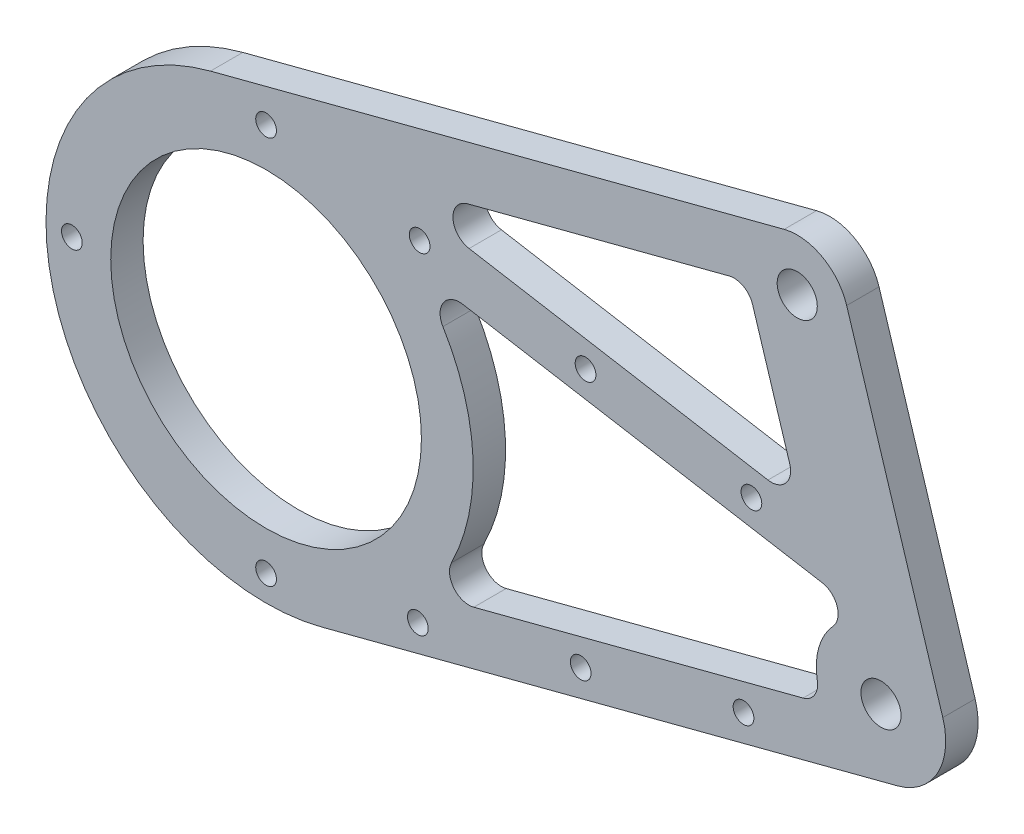
ISO-10303-21;
HEADER;
FILE_DESCRIPTION(('STEP AP214'),'2;1');
FILE_NAME('part.step','',(''),(''),'','','');
FILE_SCHEMA(('AUTOMOTIVE_DESIGN { 1 0 10303 214 1 1 1 1 }'));
ENDSEC;
DATA;
#1=APPLICATION_CONTEXT('core data for automotive mechanical design processes');
#2=APPLICATION_PROTOCOL_DEFINITION('international standard','automotive_design',2000,#1);
#3=PRODUCT_CONTEXT('',#1,'mechanical');
#4=PRODUCT('Part','Part','',(#3));
#5=PRODUCT_RELATED_PRODUCT_CATEGORY('part','',(#4));
#6=PRODUCT_DEFINITION_FORMATION('','',#4);
#7=PRODUCT_DEFINITION_CONTEXT('part definition',#1,'design');
#8=PRODUCT_DEFINITION('design','',#6,#7);
#9=PRODUCT_DEFINITION_SHAPE('','',#8);
#10=(LENGTH_UNIT() NAMED_UNIT(*) SI_UNIT(.MILLI.,.METRE.));
#11=(NAMED_UNIT(*) PLANE_ANGLE_UNIT() SI_UNIT($,.RADIAN.));
#12=(NAMED_UNIT(*) SI_UNIT($,.STERADIAN.) SOLID_ANGLE_UNIT());
#13=UNCERTAINTY_MEASURE_WITH_UNIT(LENGTH_MEASURE(1.E-05),#10,'distance_accuracy_value','');
#14=(GEOMETRIC_REPRESENTATION_CONTEXT(3) GLOBAL_UNCERTAINTY_ASSIGNED_CONTEXT((#13)) GLOBAL_UNIT_ASSIGNED_CONTEXT((#10,
#11,#12)) REPRESENTATION_CONTEXT('',''));
#15=CARTESIAN_POINT('',(0.,0.,0.));
#16=DIRECTION('',(0.,0.,1.));
#17=DIRECTION('',(1.,0.,0.));
#18=AXIS2_PLACEMENT_3D('',#15,#16,#17);
#19=CARTESIAN_POINT('',(-95.,0.,5.));
#20=DIRECTION('',(0.,0.,1.));
#21=DIRECTION('',(1.,0.,0.));
#22=AXIS2_PLACEMENT_3D('',#19,#20,#21);
#23=PLANE('',#22);
#24=DIRECTION('',(-0.297248940029587,0.954800014480146,0.));
#25=VECTOR('',#24,1.);
#26=CARTESIAN_POINT('',(-14.1227086600086,25.178769123046,5.));
#27=LINE('',#26,#25);
#28=CARTESIAN_POINT('',(-14.0963231227554,25.0940155446181,5.));
#29=VERTEX_POINT('',#28);
#30=CARTESIAN_POINT('',(-19.8385412249266,43.5387236285409,5.));
#31=VERTEX_POINT('',#30);
#32=EDGE_CURVE('E265',#29,#31,#27,.T.);
#33=ORIENTED_EDGE('',*,*,#32,.F.);
#34=CARTESIAN_POINT('',(-16.9607231661959,24.2022687245293,5.));
#35=DIRECTION('',(0.,0.,1.));
#36=DIRECTION('',(1.,0.,0.));
#37=AXIS2_PLACEMENT_3D('',#34,#35,#36);
#38=CIRCLE('',#37,3.);
#39=CARTESIAN_POINT('',(-17.4659863240906,21.2451232865648,5.));
#40=VERTEX_POINT('',#39);
#41=EDGE_CURVE('E11',#29,#40,#38,.F.);
#42=ORIENTED_EDGE('',*,*,#41,.T.);
#43=DIRECTION('',(0.985715145988166,-0.168421052631579,0.));
#44=VECTOR('',#43,1.);
#45=CARTESIAN_POINT('',(-89.2736842105262,33.5143149635983,5.));
#46=LINE('',#45,#44);
#47=CARTESIAN_POINT('',(-63.6377610345813,29.1341152841599,5.));
#48=VERTEX_POINT('',#47);
#49=EDGE_CURVE('E549',#48,#40,#46,.T.);
#50=ORIENTED_EDGE('',*,*,#49,.F.);
#51=CARTESIAN_POINT('',(-63.1324978766865,32.0912607221244,5.));
#52=DIRECTION('',(0.,0.,1.));
#53=DIRECTION('',(1.,0.,0.));
#54=AXIS2_PLACEMENT_3D('',#51,#52,#53);
#55=CIRCLE('',#54,3.);
#56=CARTESIAN_POINT('',(-63.8903601607645,34.9939568409719,5.));
#57=VERTEX_POINT('',#56);
#58=EDGE_CURVE('E255',#48,#57,#55,.F.);
#59=ORIENTED_EDGE('',*,*,#58,.T.);
#60=DIRECTION('',(-0.967565372949157,-0.252620761359313,0.));
#61=VECTOR('',#60,1.);
#62=CARTESIAN_POINT('',(-101.568139795342,25.1566996966781,5.));
#63=LINE('',#62,#61);
#64=CARTESIAN_POINT('',(-23.460803552445,45.5496729272996,5.));
#65=VERTEX_POINT('',#64);
#66=EDGE_CURVE('E268',#65,#57,#63,.T.);
#67=ORIENTED_EDGE('',*,*,#66,.F.);
#68=CARTESIAN_POINT('',(-22.7029412683671,42.6469768084522,5.));
#69=DIRECTION('',(0.,0.,1.));
#70=DIRECTION('',(1.,0.,0.));
#71=AXIS2_PLACEMENT_3D('',#68,#69,#70);
#72=CIRCLE('',#71,3.);
#73=EDGE_CURVE('E258',#65,#31,#72,.F.);
#74=ORIENTED_EDGE('',*,*,#73,.T.);
#75=EDGE_LOOP('',(#33,#42,#50,#59,#67,#74));
#76=FACE_BOUND('',#75,.T.);
#77=CARTESIAN_POINT('',(0.,0.,5.));
#78=DIRECTION('',(0.,0.,1.));
#79=DIRECTION('',(1.,0.,0.));
#80=AXIS2_PLACEMENT_3D('',#77,#78,#79);
#81=CIRCLE('',#80,10.0000000000004);
#82=CARTESIAN_POINT('',(-9.8412888861384,-1.77455150941748,5.));
#83=VERTEX_POINT('',#82);
#84=CARTESIAN_POINT('',(-7.39924695863323,6.72689708893811,5.));
#85=VERTEX_POINT('',#84);
#86=EDGE_CURVE('E347',#83,#85,#81,.F.);
#87=ORIENTED_EDGE('',*,*,#86,.F.);
#88=CARTESIAN_POINT('',(-12.7936755519798,-2.3069169622427,5.));
#89=DIRECTION('',(0.,0.,1.));
#90=DIRECTION('',(1.,0.,0.));
#91=AXIS2_PLACEMENT_3D('',#88,#89,#90);
#92=CIRCLE('',#91,3.);
#93=CARTESIAN_POINT('',(-12.0357808151377,-5.20960460783377,5.));
#94=VERTEX_POINT('',#93);
#95=EDGE_CURVE('E237',#83,#94,#92,.F.);
#96=ORIENTED_EDGE('',*,*,#95,.T.);
#97=DIRECTION('',(0.967562548530357,0.252631578947369,0.));
#98=VECTOR('',#97,1.);
#99=CARTESIAN_POINT('',(-88.4315789473688,-25.1566262617878,5.));
#100=LINE('',#99,#98);
#101=CARTESIAN_POINT('',(-62.9055257745459,-18.491747461818,5.));
#102=VERTEX_POINT('',#101);
#103=EDGE_CURVE('E344',#102,#94,#100,.T.);
#104=ORIENTED_EDGE('',*,*,#103,.F.);
#105=CARTESIAN_POINT('',(-63.663420511388,-15.5890598162269,5.));
#106=DIRECTION('',(0.,0.,1.));
#107=DIRECTION('',(1.,0.,0.));
#108=AXIS2_PLACEMENT_3D('',#105,#106,#107);
#109=CIRCLE('',#108,3.);
#110=CARTESIAN_POINT('',(-66.3494130389833,-14.2528546891217,5.));
#111=VERTEX_POINT('',#110);
#112=EDGE_CURVE('E233',#102,#111,#109,.F.);
#113=ORIENTED_EDGE('',*,*,#112,.T.);
#114=CARTESIAN_POINT('',(-95.,0.,5.));
#115=DIRECTION('',(0.,0.,1.));
#116=DIRECTION('',(1.,0.,0.));
#117=AXIS2_PLACEMENT_3D('',#114,#115,#116);
#118=CIRCLE('',#117,32.);
#119=CARTESIAN_POINT('',(-67.6823901300333,16.6657790394657,5.));
#120=VERTEX_POINT('',#119);
#121=EDGE_CURVE('E352',#120,#111,#118,.F.);
#122=ORIENTED_EDGE('',*,*,#121,.F.);
#123=CARTESIAN_POINT('',(-65.1213642047239,18.2281958244156,5.));
#124=DIRECTION('',(0.,0.,1.));
#125=DIRECTION('',(1.,0.,0.));
#126=AXIS2_PLACEMENT_3D('',#123,#124,#125);
#127=CIRCLE('',#126,3.);
#128=CARTESIAN_POINT('',(-64.6161010468291,21.1853412623801,5.));
#129=VERTEX_POINT('',#128);
#130=EDGE_CURVE('E229',#120,#129,#127,.F.);
#131=ORIENTED_EDGE('',*,*,#130,.T.);
#132=DIRECTION('',(-0.985715145988166,0.168421052631579,0.));
#133=VECTOR('',#132,1.);
#134=CARTESIAN_POINT('',(-90.6210526315788,25.628593795693,5.));
#135=LINE('',#134,#133);
#136=CARTESIAN_POINT('',(-9.11375788832837,11.702111653584,5.));
#137=VERTEX_POINT('',#136);
#138=EDGE_CURVE('E356',#137,#129,#135,.T.);
#139=ORIENTED_EDGE('',*,*,#138,.F.);
#140=CARTESIAN_POINT('',(-9.61902104622312,8.74496621561947,5.));
#141=DIRECTION('',(0.,0.,1.));
#142=DIRECTION('',(1.,0.,0.));
#143=AXIS2_PLACEMENT_3D('',#140,#141,#142);
#144=CIRCLE('',#143,3.);
#145=EDGE_CURVE('E225',#137,#85,#144,.F.);
#146=ORIENTED_EDGE('',*,*,#145,.T.);
#147=EDGE_LOOP('',(#87,#96,#104,#113,#122,#131,#139,#146));
#148=FACE_BOUND('',#147,.T.);
#149=CARTESIAN_POINT('',(-20.0172445160038,17.6230683508006,5.));
#150=DIRECTION('',(0.,0.,1.));
#151=DIRECTION('',(1.,0.,0.));
#152=AXIS2_PLACEMENT_3D('',#149,#150,#151);
#153=CIRCLE('',#152,1.6);
#154=CARTESIAN_POINT('',(-18.4172445160038,17.6230683508006,5.));
#155=VERTEX_POINT('',#154);
#156=EDGE_CURVE('E417',#155,#155,#153,.T.);
#157=ORIENTED_EDGE('',*,*,#156,.F.);
#158=EDGE_LOOP('',(#157));
#159=FACE_BOUND('',#158,.T.);
#160=CARTESIAN_POINT('',(-45.6458383116961,22.0020157192217,5.));
#161=DIRECTION('',(0.,0.,1.));
#162=DIRECTION('',(1.,0.,0.));
#163=AXIS2_PLACEMENT_3D('',#160,#161,#162);
#164=CIRCLE('',#163,1.6);
#165=CARTESIAN_POINT('',(-44.0458383116961,22.0020157192217,5.));
#166=VERTEX_POINT('',#165);
#167=EDGE_CURVE('E414',#166,#166,#164,.T.);
#168=ORIENTED_EDGE('',*,*,#167,.F.);
#169=EDGE_LOOP('',(#168));
#170=FACE_BOUND('',#169,.T.);
#171=CARTESIAN_POINT('',(-71.2744321073884,26.3809630876427,5.));
#172=DIRECTION('',(0.,0.,1.));
#173=DIRECTION('',(1.,0.,0.));
#174=AXIS2_PLACEMENT_3D('',#171,#172,#173);
#175=CIRCLE('',#174,1.6);
#176=CARTESIAN_POINT('',(-69.6744321073884,26.3809630876427,5.));
#177=VERTEX_POINT('',#176);
#178=EDGE_CURVE('E411',#177,#177,#175,.T.);
#179=ORIENTED_EDGE('',*,*,#178,.F.);
#180=EDGE_LOOP('',(#179));
#181=FACE_BOUND('',#180,.T.);
#182=CARTESIAN_POINT('',(-95.,30.0000000000015,5.));
#183=DIRECTION('',(0.,0.,1.));
#184=DIRECTION('',(1.,0.,0.));
#185=AXIS2_PLACEMENT_3D('',#182,#183,#184);
#186=CIRCLE('',#185,1.60000000000103);
#187=CARTESIAN_POINT('',(-93.399999999999,30.0000000000015,5.));
#188=VERTEX_POINT('',#187);
#189=EDGE_CURVE('E408',#188,#188,#186,.T.);
#190=ORIENTED_EDGE('',*,*,#189,.F.);
#191=EDGE_LOOP('',(#190));
#192=FACE_BOUND('',#191,.T.);
#193=CARTESIAN_POINT('',(-125.000000000002,0.,5.));
#194=DIRECTION('',(0.,0.,1.));
#195=DIRECTION('',(1.,0.,0.));
#196=AXIS2_PLACEMENT_3D('',#193,#194,#195);
#197=CIRCLE('',#196,1.59999999999999);
#198=CARTESIAN_POINT('',(-123.400000000002,0.,5.));
#199=VERTEX_POINT('',#198);
#200=EDGE_CURVE('E405',#199,#199,#197,.T.);
#201=ORIENTED_EDGE('',*,*,#200,.F.);
#202=EDGE_LOOP('',(#201));
#203=FACE_BOUND('',#202,.T.);
#204=CARTESIAN_POINT('',(-95.,-30.0000000000015,5.));
#205=DIRECTION('',(0.,0.,1.));
#206=DIRECTION('',(1.,0.,0.));
#207=AXIS2_PLACEMENT_3D('',#204,#205,#206);
#208=CIRCLE('',#207,1.60000000000046);
#209=CARTESIAN_POINT('',(-93.3999999999995,-30.0000000000015,5.));
#210=VERTEX_POINT('',#209);
#211=EDGE_CURVE('E402',#210,#210,#208,.T.);
#212=ORIENTED_EDGE('',*,*,#211,.F.);
#213=EDGE_LOOP('',(#212));
#214=FACE_BOUND('',#213,.T.);
#215=CARTESIAN_POINT('',(-71.5517535365,-24.8833861014445,5.));
#216=DIRECTION('',(0.,0.,1.));
#217=DIRECTION('',(1.,0.,0.));
#218=AXIS2_PLACEMENT_3D('',#215,#216,#217);
#219=CIRCLE('',#218,1.6);
#220=CARTESIAN_POINT('',(-69.9517535365,-24.8833861014445,5.));
#221=VERTEX_POINT('',#220);
#222=EDGE_CURVE('E399',#221,#221,#219,.T.);
#223=ORIENTED_EDGE('',*,*,#222,.F.);
#224=EDGE_LOOP('',(#223));
#225=FACE_BOUND('',#224,.T.);
#226=CARTESIAN_POINT('',(-46.3951272747108,-18.314965048813,5.));
#227=DIRECTION('',(0.,0.,1.));
#228=DIRECTION('',(1.,0.,0.));
#229=AXIS2_PLACEMENT_3D('',#226,#227,#228);
#230=CIRCLE('',#229,1.6);
#231=CARTESIAN_POINT('',(-44.7951272747108,-18.314965048813,5.));
#232=VERTEX_POINT('',#231);
#233=EDGE_CURVE('E396',#232,#232,#230,.T.);
#234=ORIENTED_EDGE('',*,*,#233,.F.);
#235=EDGE_LOOP('',(#234));
#236=FACE_BOUND('',#235,.T.);
#237=CARTESIAN_POINT('',(-21.2385010129215,-11.7465439961814,5.));
#238=DIRECTION('',(0.,0.,1.));
#239=DIRECTION('',(1.,0.,0.));
#240=AXIS2_PLACEMENT_3D('',#237,#238,#239);
#241=CIRCLE('',#240,1.6);
#242=CARTESIAN_POINT('',(-19.6385010129215,-11.7465439961814,5.));
#243=VERTEX_POINT('',#242);
#244=EDGE_CURVE('E393',#243,#243,#241,.T.);
#245=ORIENTED_EDGE('',*,*,#244,.F.);
#246=EDGE_LOOP('',(#245));
#247=FACE_BOUND('',#246,.T.);
#248=CARTESIAN_POINT('',(-95.,0.,5.));
#249=DIRECTION('',(0.,0.,1.));
#250=DIRECTION('',(1.,0.,0.));
#251=AXIS2_PLACEMENT_3D('',#248,#249,#250);
#252=CIRCLE('',#251,24.);
#253=CARTESIAN_POINT('',(-71.,0.,5.));
#254=VERTEX_POINT('',#253);
#255=EDGE_CURVE('E427',#254,#254,#252,.T.);
#256=ORIENTED_EDGE('',*,*,#255,.F.);
#257=EDGE_LOOP('',(#256));
#258=FACE_BOUND('',#257,.T.);
#259=CARTESIAN_POINT('',(-95.,0.,5.));
#260=DIRECTION('',(0.,0.,1.));
#261=DIRECTION('',(1.,0.,0.));
#262=AXIS2_PLACEMENT_3D('',#259,#260,#261);
#263=CIRCLE('',#262,34.);
#264=CARTESIAN_POINT('',(-103.589105886217,32.8972226802713,5.));
#265=VERTEX_POINT('',#264);
#266=CARTESIAN_POINT('',(-86.4105263157895,-32.8971266500322,5.));
#267=VERTEX_POINT('',#266);
#268=EDGE_CURVE('E184',#265,#267,#263,.T.);
#269=ORIENTED_EDGE('',*,*,#268,.T.);
#270=DIRECTION('',(0.967562548530357,0.252631578947369,0.));
#271=VECTOR('',#270,1.);
#272=CARTESIAN_POINT('',(-86.4105263157895,-32.8971266500322,5.));
#273=LINE('',#272,#271);
#274=CARTESIAN_POINT('',(2.52631578947369,-9.67562548530357,5.));
#275=VERTEX_POINT('',#274);
#276=EDGE_CURVE('E173',#267,#275,#273,.T.);
#277=ORIENTED_EDGE('',*,*,#276,.T.);
#278=CARTESIAN_POINT('',(0.,0.,5.));
#279=DIRECTION('',(0.,0.,1.));
#280=DIRECTION('',(1.,0.,0.));
#281=AXIS2_PLACEMENT_3D('',#278,#279,#280);
#282=CIRCLE('',#281,10.);
#283=CARTESIAN_POINT('',(9.54800014480146,2.97248940029587,5.));
#284=VERTEX_POINT('',#283);
#285=EDGE_CURVE('E183',#275,#284,#282,.T.);
#286=ORIENTED_EDGE('',*,*,#285,.T.);
#287=DIRECTION('',(-0.297248940029587,0.954800014480146,0.));
#288=VECTOR('',#287,1.);
#289=CARTESIAN_POINT('',(-5.30255213928509,50.6742828346901,5.));
#290=LINE('',#289,#288);
#291=CARTESIAN_POINT('',(-5.30255213928508,50.6742828346901,5.));
#292=VERTEX_POINT('',#291);
#293=EDGE_CURVE('E439',#284,#292,#290,.T.);
#294=ORIENTED_EDGE('',*,*,#293,.T.);
#295=CARTESIAN_POINT('',(-12.9409522551263,48.2962913144534,5.));
#296=DIRECTION('',(0.,0.,1.));
#297=DIRECTION('',(1.,0.,0.));
#298=AXIS2_PLACEMENT_3D('',#295,#296,#297);
#299=CIRCLE('',#298,8.00000000000001);
#300=CARTESIAN_POINT('',(-14.9619183460008,56.0368142980466,5.));
#301=VERTEX_POINT('',#300);
#302=EDGE_CURVE('E441',#292,#301,#299,.T.);
#303=ORIENTED_EDGE('',*,*,#302,.T.);
#304=DIRECTION('',(-0.967565372949157,-0.252620761359313,0.));
#305=VECTOR('',#304,1.);
#306=CARTESIAN_POINT('',(-103.589105886217,32.8972226802713,5.));
#307=LINE('',#306,#305);
#308=EDGE_CURVE('E189',#301,#265,#307,.T.);
#309=ORIENTED_EDGE('',*,*,#308,.T.);
#310=EDGE_LOOP('',(#269,#277,#286,#294,#303,#309));
#311=FACE_BOUND('',#310,.T.);
#312=CARTESIAN_POINT('',(0.,0.,5.));
#313=DIRECTION('',(0.,0.,1.));
#314=DIRECTION('',(1.,0.,0.));
#315=AXIS2_PLACEMENT_3D('',#312,#313,#314);
#316=CIRCLE('',#315,3.1);
#317=CARTESIAN_POINT('',(3.1,0.,5.));
#318=VERTEX_POINT('',#317);
#319=EDGE_CURVE('E433',#318,#318,#316,.T.);
#320=ORIENTED_EDGE('',*,*,#319,.F.);
#321=EDGE_LOOP('',(#320));
#322=FACE_BOUND('',#321,.T.);
#323=CARTESIAN_POINT('',(-12.9409522551263,48.2962913144534,5.));
#324=DIRECTION('',(0.,0.,1.));
#325=DIRECTION('',(1.,0.,0.));
#326=AXIS2_PLACEMENT_3D('',#323,#324,#325);
#327=CIRCLE('',#326,3.1);
#328=CARTESIAN_POINT('',(-9.84095225512626,48.2962913144534,5.));
#329=VERTEX_POINT('',#328);
#330=EDGE_CURVE('E421',#329,#329,#327,.T.);
#331=ORIENTED_EDGE('',*,*,#330,.F.);
#332=EDGE_LOOP('',(#331));
#333=FACE_BOUND('',#332,.T.);
#334=ADVANCED_FACE('F36',(#76,#148,#159,#170,#181,#192,#203,#214,#225,#236,#247,#258,#311,#322,
#333),#23,.T.);
#335=CARTESIAN_POINT('',(-95.,0.,0.));
#336=DIRECTION('',(0.,0.,1.));
#337=DIRECTION('',(1.,0.,0.));
#338=AXIS2_PLACEMENT_3D('',#335,#336,#337);
#339=PLANE('',#338);
#340=DIRECTION('',(-0.985715145988166,0.168421052631579,0.));
#341=VECTOR('',#340,1.);
#342=CARTESIAN_POINT('',(-77.3564331087173,31.4781121283164,0.));
#343=LINE('',#342,#341);
#344=CARTESIAN_POINT('',(-17.4659863240906,21.2451232865648,0.));
#345=VERTEX_POINT('',#344);
#346=CARTESIAN_POINT('',(-63.6377610345813,29.1341152841599,0.));
#347=VERTEX_POINT('',#346);
#348=EDGE_CURVE('E555',#345,#347,#343,.T.);
#349=ORIENTED_EDGE('',*,*,#348,.F.);
#350=CARTESIAN_POINT('',(-16.9607231661959,24.2022687245293,0.));
#351=DIRECTION('',(0.,0.,1.));
#352=DIRECTION('',(1.,0.,0.));
#353=AXIS2_PLACEMENT_3D('',#350,#351,#352);
#354=CIRCLE('',#353,3.);
#355=CARTESIAN_POINT('',(-14.0963231227554,25.0940155446181,0.));
#356=VERTEX_POINT('',#355);
#357=EDGE_CURVE('E44',#345,#356,#354,.T.);
#358=ORIENTED_EDGE('',*,*,#357,.T.);
#359=DIRECTION('',(0.297248940029587,-0.954800014480146,0.));
#360=VECTOR('',#359,1.);
#361=CARTESIAN_POINT('',(-12.6414531433946,20.4207949194337,0.));
#362=LINE('',#361,#360);
#363=CARTESIAN_POINT('',(-19.8385412249266,43.5387236285409,0.));
#364=VERTEX_POINT('',#363);
#365=EDGE_CURVE('E560',#364,#356,#362,.T.);
#366=ORIENTED_EDGE('',*,*,#365,.F.);
#367=CARTESIAN_POINT('',(-22.7029412683671,42.6469768084522,0.));
#368=DIRECTION('',(0.,0.,1.));
#369=DIRECTION('',(1.,0.,0.));
#370=AXIS2_PLACEMENT_3D('',#367,#368,#369);
#371=CIRCLE('',#370,3.);
#372=CARTESIAN_POINT('',(-23.460803552445,45.5496729272996,0.));
#373=VERTEX_POINT('',#372);
#374=EDGE_CURVE('E58',#364,#373,#371,.T.);
#375=ORIENTED_EDGE('',*,*,#374,.T.);
#376=DIRECTION('',(0.967565372949157,0.252620761359313,0.));
#377=VECTOR('',#376,1.);
#378=CARTESIAN_POINT('',(-20.689823208626,46.2731456597245,0.));
#379=LINE('',#378,#377);
#380=CARTESIAN_POINT('',(-63.8903601607645,34.9939568409719,0.));
#381=VERTEX_POINT('',#380);
#382=EDGE_CURVE('E556',#381,#373,#379,.T.);
#383=ORIENTED_EDGE('',*,*,#382,.F.);
#384=CARTESIAN_POINT('',(-63.1324978766865,32.0912607221244,0.));
#385=DIRECTION('',(0.,0.,1.));
#386=DIRECTION('',(1.,0.,0.));
#387=AXIS2_PLACEMENT_3D('',#384,#385,#386);
#388=CIRCLE('',#387,3.);
#389=EDGE_CURVE('E253',#381,#347,#388,.T.);
#390=ORIENTED_EDGE('',*,*,#389,.T.);
#391=EDGE_LOOP('',(#349,#358,#366,#375,#383,#390));
#392=FACE_BOUND('',#391,.T.);
#393=DIRECTION('',(-0.967562548530357,-0.252631578947369,0.));
#394=VECTOR('',#393,1.);
#395=CARTESIAN_POINT('',(-70.3819336519362,-20.4438452665424,0.));
#396=LINE('',#395,#394);
#397=CARTESIAN_POINT('',(-12.0357808151377,-5.20960460783377,0.));
#398=VERTEX_POINT('',#397);
#399=CARTESIAN_POINT('',(-62.9055257745459,-18.491747461818,0.));
#400=VERTEX_POINT('',#399);
#401=EDGE_CURVE('E568',#398,#400,#396,.T.);
#402=ORIENTED_EDGE('',*,*,#401,.F.);
#403=CARTESIAN_POINT('',(-12.7936755519798,-2.3069169622427,0.));
#404=DIRECTION('',(0.,0.,1.));
#405=DIRECTION('',(1.,0.,0.));
#406=AXIS2_PLACEMENT_3D('',#403,#404,#405);
#407=CIRCLE('',#406,3.);
#408=CARTESIAN_POINT('',(-9.8412888861384,-1.77455150941748,0.));
#409=VERTEX_POINT('',#408);
#410=EDGE_CURVE('E235',#398,#409,#407,.T.);
#411=ORIENTED_EDGE('',*,*,#410,.T.);
#412=CARTESIAN_POINT('',(0.,0.,0.));
#413=DIRECTION('',(0.,0.,1.));
#414=DIRECTION('',(-1.,0.,0.));
#415=AXIS2_PLACEMENT_3D('',#412,#413,#414);
#416=CIRCLE('',#415,10.0000000000004);
#417=CARTESIAN_POINT('',(-7.39924695863323,6.72689708893811,0.));
#418=VERTEX_POINT('',#417);
#419=EDGE_CURVE('E272',#418,#409,#416,.T.);
#420=ORIENTED_EDGE('',*,*,#419,.F.);
#421=CARTESIAN_POINT('',(-9.61902104622312,8.74496621561947,0.));
#422=DIRECTION('',(0.,0.,1.));
#423=DIRECTION('',(1.,0.,0.));
#424=AXIS2_PLACEMENT_3D('',#421,#422,#423);
#425=CIRCLE('',#424,3.);
#426=CARTESIAN_POINT('',(-9.11375788832838,11.702111653584,0.));
#427=VERTEX_POINT('',#426);
#428=EDGE_CURVE('E223',#418,#427,#425,.T.);
#429=ORIENTED_EDGE('',*,*,#428,.T.);
#430=DIRECTION('',(0.985715145988166,-0.168421052631579,0.));
#431=VECTOR('',#430,1.);
#432=CARTESIAN_POINT('',(1.68421052631591,9.85715145988236,0.));
#433=LINE('',#432,#431);
#434=CARTESIAN_POINT('',(-64.6161010468291,21.1853412623801,0.));
#435=VERTEX_POINT('',#434);
#436=EDGE_CURVE('E353',#435,#427,#433,.T.);
#437=ORIENTED_EDGE('',*,*,#436,.F.);
#438=CARTESIAN_POINT('',(-65.1213642047239,18.2281958244156,0.));
#439=DIRECTION('',(0.,0.,1.));
#440=DIRECTION('',(1.,0.,0.));
#441=AXIS2_PLACEMENT_3D('',#438,#439,#440);
#442=CIRCLE('',#441,3.);
#443=CARTESIAN_POINT('',(-67.6823901300333,16.6657790394657,0.));
#444=VERTEX_POINT('',#443);
#445=EDGE_CURVE('E227',#435,#444,#442,.T.);
#446=ORIENTED_EDGE('',*,*,#445,.T.);
#447=CARTESIAN_POINT('',(-95.,0.,0.));
#448=DIRECTION('',(0.,0.,1.));
#449=DIRECTION('',(-1.,0.,0.));
#450=AXIS2_PLACEMENT_3D('',#447,#448,#449);
#451=CIRCLE('',#450,32.);
#452=CARTESIAN_POINT('',(-66.3494130389833,-14.2528546891217,0.));
#453=VERTEX_POINT('',#452);
#454=EDGE_CURVE('E359',#453,#444,#451,.T.);
#455=ORIENTED_EDGE('',*,*,#454,.F.);
#456=CARTESIAN_POINT('',(-63.663420511388,-15.5890598162269,0.));
#457=DIRECTION('',(0.,0.,1.));
#458=DIRECTION('',(1.,0.,0.));
#459=AXIS2_PLACEMENT_3D('',#456,#457,#458);
#460=CIRCLE('',#459,3.);
#461=EDGE_CURVE('E231',#453,#400,#460,.T.);
#462=ORIENTED_EDGE('',*,*,#461,.T.);
#463=EDGE_LOOP('',(#402,#411,#420,#429,#437,#446,#455,#462));
#464=FACE_BOUND('',#463,.T.);
#465=CARTESIAN_POINT('',(-20.0172445160038,17.6230683508006,0.));
#466=DIRECTION('',(0.,0.,-1.));
#467=DIRECTION('',(-1.,0.,0.));
#468=AXIS2_PLACEMENT_3D('',#465,#466,#467);
#469=CIRCLE('',#468,1.6);
#470=CARTESIAN_POINT('',(-21.6172445160038,17.6230683508006,0.));
#471=VERTEX_POINT('',#470);
#472=EDGE_CURVE('E366',#471,#471,#469,.T.);
#473=ORIENTED_EDGE('',*,*,#472,.F.);
#474=EDGE_LOOP('',(#473));
#475=FACE_BOUND('',#474,.T.);
#476=CARTESIAN_POINT('',(-45.6458383116961,22.0020157192217,0.));
#477=DIRECTION('',(0.,0.,-1.));
#478=DIRECTION('',(-1.,0.,0.));
#479=AXIS2_PLACEMENT_3D('',#476,#477,#478);
#480=CIRCLE('',#479,1.6);
#481=CARTESIAN_POINT('',(-47.2458383116961,22.0020157192217,0.));
#482=VERTEX_POINT('',#481);
#483=EDGE_CURVE('E386',#482,#482,#480,.T.);
#484=ORIENTED_EDGE('',*,*,#483,.F.);
#485=EDGE_LOOP('',(#484));
#486=FACE_BOUND('',#485,.T.);
#487=CARTESIAN_POINT('',(-71.2744321073884,26.3809630876427,0.));
#488=DIRECTION('',(0.,0.,-1.));
#489=DIRECTION('',(-1.,0.,0.));
#490=AXIS2_PLACEMENT_3D('',#487,#488,#489);
#491=CIRCLE('',#490,1.6);
#492=CARTESIAN_POINT('',(-72.8744321073884,26.3809630876427,0.));
#493=VERTEX_POINT('',#492);
#494=EDGE_CURVE('E383',#493,#493,#491,.T.);
#495=ORIENTED_EDGE('',*,*,#494,.F.);
#496=EDGE_LOOP('',(#495));
#497=FACE_BOUND('',#496,.T.);
#498=CARTESIAN_POINT('',(-95.,30.0000000000015,0.));
#499=DIRECTION('',(0.,0.,-1.));
#500=DIRECTION('',(-1.,0.,0.));
#501=AXIS2_PLACEMENT_3D('',#498,#499,#500);
#502=CIRCLE('',#501,1.60000000000103);
#503=CARTESIAN_POINT('',(-96.600000000001,30.0000000000015,0.));
#504=VERTEX_POINT('',#503);
#505=EDGE_CURVE('E380',#504,#504,#502,.T.);
#506=ORIENTED_EDGE('',*,*,#505,.F.);
#507=EDGE_LOOP('',(#506));
#508=FACE_BOUND('',#507,.T.);
#509=CARTESIAN_POINT('',(-125.000000000002,0.,0.));
#510=DIRECTION('',(0.,0.,-1.));
#511=DIRECTION('',(-1.,0.,0.));
#512=AXIS2_PLACEMENT_3D('',#509,#510,#511);
#513=CIRCLE('',#512,1.59999999999999);
#514=CARTESIAN_POINT('',(-126.600000000002,0.,0.));
#515=VERTEX_POINT('',#514);
#516=EDGE_CURVE('E377',#515,#515,#513,.T.);
#517=ORIENTED_EDGE('',*,*,#516,.F.);
#518=EDGE_LOOP('',(#517));
#519=FACE_BOUND('',#518,.T.);
#520=CARTESIAN_POINT('',(-95.,-30.0000000000015,0.));
#521=DIRECTION('',(0.,0.,-1.));
#522=DIRECTION('',(-1.,0.,0.));
#523=AXIS2_PLACEMENT_3D('',#520,#521,#522);
#524=CIRCLE('',#523,1.60000000000046);
#525=CARTESIAN_POINT('',(-96.6000000000005,-30.0000000000015,0.));
#526=VERTEX_POINT('',#525);
#527=EDGE_CURVE('E374',#526,#526,#524,.T.);
#528=ORIENTED_EDGE('',*,*,#527,.F.);
#529=EDGE_LOOP('',(#528));
#530=FACE_BOUND('',#529,.T.);
#531=CARTESIAN_POINT('',(-71.5517535365,-24.8833861014445,0.));
#532=DIRECTION('',(0.,0.,-1.));
#533=DIRECTION('',(-1.,0.,0.));
#534=AXIS2_PLACEMENT_3D('',#531,#532,#533);
#535=CIRCLE('',#534,1.6);
#536=CARTESIAN_POINT('',(-73.1517535365001,-24.8833861014445,0.));
#537=VERTEX_POINT('',#536);
#538=EDGE_CURVE('E371',#537,#537,#535,.T.);
#539=ORIENTED_EDGE('',*,*,#538,.F.);
#540=EDGE_LOOP('',(#539));
#541=FACE_BOUND('',#540,.T.);
#542=CARTESIAN_POINT('',(-46.3951272747108,-18.314965048813,0.));
#543=DIRECTION('',(0.,0.,-1.));
#544=DIRECTION('',(-1.,0.,0.));
#545=AXIS2_PLACEMENT_3D('',#542,#543,#544);
#546=CIRCLE('',#545,1.6);
#547=CARTESIAN_POINT('',(-47.9951272747108,-18.314965048813,0.));
#548=VERTEX_POINT('',#547);
#549=EDGE_CURVE('E367',#548,#548,#546,.T.);
#550=ORIENTED_EDGE('',*,*,#549,.F.);
#551=EDGE_LOOP('',(#550));
#552=FACE_BOUND('',#551,.T.);
#553=CARTESIAN_POINT('',(-21.2385010129215,-11.7465439961814,0.));
#554=DIRECTION('',(0.,0.,-1.));
#555=DIRECTION('',(-1.,0.,0.));
#556=AXIS2_PLACEMENT_3D('',#553,#554,#555);
#557=CIRCLE('',#556,1.6);
#558=CARTESIAN_POINT('',(-22.8385010129215,-11.7465439961814,0.));
#559=VERTEX_POINT('',#558);
#560=EDGE_CURVE('E370',#559,#559,#557,.T.);
#561=ORIENTED_EDGE('',*,*,#560,.F.);
#562=EDGE_LOOP('',(#561));
#563=FACE_BOUND('',#562,.T.);
#564=CARTESIAN_POINT('',(-95.,0.,0.));
#565=DIRECTION('',(0.,0.,1.));
#566=DIRECTION('',(1.,0.,0.));
#567=AXIS2_PLACEMENT_3D('',#564,#565,#566);
#568=CIRCLE('',#567,34.);
#569=CARTESIAN_POINT('',(-103.589105886217,32.8972226802713,0.));
#570=VERTEX_POINT('',#569);
#571=CARTESIAN_POINT('',(-86.4105263157895,-32.8971266500322,0.));
#572=VERTEX_POINT('',#571);
#573=EDGE_CURVE('E197',#570,#572,#568,.T.);
#574=ORIENTED_EDGE('',*,*,#573,.F.);
#575=DIRECTION('',(-0.967565372949157,-0.252620761359313,0.));
#576=VECTOR('',#575,1.);
#577=CARTESIAN_POINT('',(-103.589105886217,32.8972226802713,0.));
#578=LINE('',#577,#576);
#579=CARTESIAN_POINT('',(-14.9619183460008,56.0368142980466,0.));
#580=VERTEX_POINT('',#579);
#581=EDGE_CURVE('E193',#580,#570,#578,.T.);
#582=ORIENTED_EDGE('',*,*,#581,.F.);
#583=CARTESIAN_POINT('',(-12.9409522551263,48.2962913144534,0.));
#584=DIRECTION('',(0.,0.,1.));
#585=DIRECTION('',(1.,0.,0.));
#586=AXIS2_PLACEMENT_3D('',#583,#584,#585);
#587=CIRCLE('',#586,8.00000000000001);
#588=CARTESIAN_POINT('',(-5.30255213928508,50.6742828346901,0.));
#589=VERTEX_POINT('',#588);
#590=EDGE_CURVE('E452',#589,#580,#587,.T.);
#591=ORIENTED_EDGE('',*,*,#590,.F.);
#592=DIRECTION('',(-0.297248940029587,0.954800014480146,0.));
#593=VECTOR('',#592,1.);
#594=CARTESIAN_POINT('',(-5.30255213928509,50.6742828346901,0.));
#595=LINE('',#594,#593);
#596=CARTESIAN_POINT('',(9.54800014480146,2.97248940029587,0.));
#597=VERTEX_POINT('',#596);
#598=EDGE_CURVE('E450',#597,#589,#595,.T.);
#599=ORIENTED_EDGE('',*,*,#598,.F.);
#600=CARTESIAN_POINT('',(0.,0.,0.));
#601=DIRECTION('',(0.,0.,1.));
#602=DIRECTION('',(1.,0.,0.));
#603=AXIS2_PLACEMENT_3D('',#600,#601,#602);
#604=CIRCLE('',#603,10.);
#605=CARTESIAN_POINT('',(2.52631578947369,-9.67562548530357,0.));
#606=VERTEX_POINT('',#605);
#607=EDGE_CURVE('E448',#606,#597,#604,.T.);
#608=ORIENTED_EDGE('',*,*,#607,.F.);
#609=DIRECTION('',(0.967562548530357,0.252631578947369,0.));
#610=VECTOR('',#609,1.);
#611=CARTESIAN_POINT('',(-86.4105263157895,-32.8971266500322,0.));
#612=LINE('',#611,#610);
#613=EDGE_CURVE('E446',#572,#606,#612,.T.);
#614=ORIENTED_EDGE('',*,*,#613,.F.);
#615=EDGE_LOOP('',(#574,#582,#591,#599,#608,#614));
#616=FACE_BOUND('',#615,.T.);
#617=CARTESIAN_POINT('',(0.,0.,0.));
#618=DIRECTION('',(0.,0.,1.));
#619=DIRECTION('',(1.,0.,0.));
#620=AXIS2_PLACEMENT_3D('',#617,#618,#619);
#621=CIRCLE('',#620,3.1);
#622=CARTESIAN_POINT('',(3.1,0.,0.));
#623=VERTEX_POINT('',#622);
#624=EDGE_CURVE('E430',#623,#623,#621,.T.);
#625=ORIENTED_EDGE('',*,*,#624,.T.);
#626=EDGE_LOOP('',(#625));
#627=FACE_BOUND('',#626,.T.);
#628=CARTESIAN_POINT('',(-95.,0.,0.));
#629=DIRECTION('',(0.,0.,1.));
#630=DIRECTION('',(1.,0.,0.));
#631=AXIS2_PLACEMENT_3D('',#628,#629,#630);
#632=CIRCLE('',#631,24.);
#633=CARTESIAN_POINT('',(-71.,0.,0.));
#634=VERTEX_POINT('',#633);
#635=EDGE_CURVE('E424',#634,#634,#632,.T.);
#636=ORIENTED_EDGE('',*,*,#635,.T.);
#637=EDGE_LOOP('',(#636));
#638=FACE_BOUND('',#637,.T.);
#639=CARTESIAN_POINT('',(-12.9409522551263,48.2962913144534,0.));
#640=DIRECTION('',(0.,0.,1.));
#641=DIRECTION('',(1.,0.,0.));
#642=AXIS2_PLACEMENT_3D('',#639,#640,#641);
#643=CIRCLE('',#642,3.1);
#644=CARTESIAN_POINT('',(-9.84095225512626,48.2962913144534,0.));
#645=VERTEX_POINT('',#644);
#646=EDGE_CURVE('E420',#645,#645,#643,.T.);
#647=ORIENTED_EDGE('',*,*,#646,.T.);
#648=EDGE_LOOP('',(#647));
#649=FACE_BOUND('',#648,.T.);
#650=ADVANCED_FACE('F286',(#392,#464,#475,#486,#497,#508,#519,#530,#541,#552,#563,#616,#627,
#638,#649),#339,.F.);
#651=CARTESIAN_POINT('',(-95.,0.,5.));
#652=DIRECTION('',(0.,0.,-1.));
#653=DIRECTION('',(-1.,0.,0.));
#654=AXIS2_PLACEMENT_3D('',#651,#652,#653);
#655=CYLINDRICAL_SURFACE('',#654,34.);
#656=ORIENTED_EDGE('',*,*,#573,.T.);
#657=DIRECTION('',(0.,0.,-1.));
#658=VECTOR('',#657,1.);
#659=CARTESIAN_POINT('',(-86.4105263157895,-32.8971266500322,5.));
#660=LINE('',#659,#658);
#661=EDGE_CURVE('E177',#267,#572,#660,.T.);
#662=ORIENTED_EDGE('',*,*,#661,.F.);
#663=ORIENTED_EDGE('',*,*,#268,.F.);
#664=DIRECTION('',(0.,0.,-1.));
#665=VECTOR('',#664,1.);
#666=CARTESIAN_POINT('',(-103.589105886217,32.8972226802713,5.));
#667=LINE('',#666,#665);
#668=EDGE_CURVE('E444',#265,#570,#667,.T.);
#669=ORIENTED_EDGE('',*,*,#668,.T.);
#670=EDGE_LOOP('',(#656,#662,#663,#669));
#671=FACE_BOUND('',#670,.T.);
#672=ADVANCED_FACE('F195',(#671),#655,.T.);
#673=CARTESIAN_POINT('',(-86.4105263157895,-32.8971266500322,5.));
#674=DIRECTION('',(-0.252631578947369,0.967562548530357,0.));
#675=DIRECTION('',(-0.967562548530357,-0.252631578947369,0.));
#676=AXIS2_PLACEMENT_3D('',#673,#674,#675);
#677=PLANE('',#676);
#678=ORIENTED_EDGE('',*,*,#613,.T.);
#679=DIRECTION('',(0.,0.,-1.));
#680=VECTOR('',#679,1.);
#681=CARTESIAN_POINT('',(2.52631578947369,-9.67562548530357,5.));
#682=LINE('',#681,#680);
#683=EDGE_CURVE('E180',#275,#606,#682,.T.);
#684=ORIENTED_EDGE('',*,*,#683,.F.);
#685=ORIENTED_EDGE('',*,*,#276,.F.);
#686=ORIENTED_EDGE('',*,*,#661,.T.);
#687=EDGE_LOOP('',(#678,#684,#685,#686));
#688=FACE_BOUND('',#687,.T.);
#689=ADVANCED_FACE('F175',(#688),#677,.F.);
#690=CARTESIAN_POINT('',(0.,0.,5.));
#691=DIRECTION('',(0.,0.,-1.));
#692=DIRECTION('',(-1.,0.,0.));
#693=AXIS2_PLACEMENT_3D('',#690,#691,#692);
#694=CYLINDRICAL_SURFACE('',#693,10.);
#695=ORIENTED_EDGE('',*,*,#607,.T.);
#696=DIRECTION('',(0.,0.,-1.));
#697=VECTOR('',#696,1.);
#698=CARTESIAN_POINT('',(9.54800014480146,2.97248940029587,5.));
#699=LINE('',#698,#697);
#700=EDGE_CURVE('E202',#284,#597,#699,.T.);
#701=ORIENTED_EDGE('',*,*,#700,.F.);
#702=ORIENTED_EDGE('',*,*,#285,.F.);
#703=ORIENTED_EDGE('',*,*,#683,.T.);
#704=EDGE_LOOP('',(#695,#701,#702,#703));
#705=FACE_BOUND('',#704,.T.);
#706=ADVANCED_FACE('F307',(#705),#694,.T.);
#707=CARTESIAN_POINT('',(-5.30255213928509,50.6742828346901,5.));
#708=DIRECTION('',(-0.954800014480146,-0.297248940029587,0.));
#709=DIRECTION('',(0.297248940029587,-0.954800014480146,0.));
#710=AXIS2_PLACEMENT_3D('',#707,#708,#709);
#711=PLANE('',#710);
#712=ORIENTED_EDGE('',*,*,#598,.T.);
#713=DIRECTION('',(0.,0.,-1.));
#714=VECTOR('',#713,1.);
#715=CARTESIAN_POINT('',(-5.30255213928508,50.6742828346901,5.));
#716=LINE('',#715,#714);
#717=EDGE_CURVE('E459',#292,#589,#716,.T.);
#718=ORIENTED_EDGE('',*,*,#717,.F.);
#719=ORIENTED_EDGE('',*,*,#293,.F.);
#720=ORIENTED_EDGE('',*,*,#700,.T.);
#721=EDGE_LOOP('',(#712,#718,#719,#720));
#722=FACE_BOUND('',#721,.T.);
#723=ADVANCED_FACE('F303',(#722),#711,.F.);
#724=CARTESIAN_POINT('',(-12.9409522551263,48.2962913144534,5.));
#725=DIRECTION('',(0.,0.,-1.));
#726=DIRECTION('',(-1.,0.,0.));
#727=AXIS2_PLACEMENT_3D('',#724,#725,#726);
#728=CYLINDRICAL_SURFACE('',#727,8.00000000000001);
#729=ORIENTED_EDGE('',*,*,#590,.T.);
#730=DIRECTION('',(0.,0.,-1.));
#731=VECTOR('',#730,1.);
#732=CARTESIAN_POINT('',(-14.9619183460008,56.0368142980466,5.));
#733=LINE('',#732,#731);
#734=EDGE_CURVE('E456',#301,#580,#733,.T.);
#735=ORIENTED_EDGE('',*,*,#734,.F.);
#736=ORIENTED_EDGE('',*,*,#302,.F.);
#737=ORIENTED_EDGE('',*,*,#717,.T.);
#738=EDGE_LOOP('',(#729,#735,#736,#737));
#739=FACE_BOUND('',#738,.T.);
#740=ADVANCED_FACE('F299',(#739),#728,.T.);
#741=CARTESIAN_POINT('',(-103.589105886217,32.8972226802713,5.));
#742=DIRECTION('',(0.252620761359313,-0.967565372949157,0.));
#743=DIRECTION('',(0.967565372949157,0.252620761359313,0.));
#744=AXIS2_PLACEMENT_3D('',#741,#742,#743);
#745=PLANE('',#744);
#746=ORIENTED_EDGE('',*,*,#581,.T.);
#747=ORIENTED_EDGE('',*,*,#668,.F.);
#748=ORIENTED_EDGE('',*,*,#308,.F.);
#749=ORIENTED_EDGE('',*,*,#734,.T.);
#750=EDGE_LOOP('',(#746,#747,#748,#749));
#751=FACE_BOUND('',#750,.T.);
#752=ADVANCED_FACE('F296',(#751),#745,.F.);
#753=CARTESIAN_POINT('',(0.,0.,5.));
#754=DIRECTION('',(0.,0.,-1.));
#755=DIRECTION('',(-1.,0.,0.));
#756=AXIS2_PLACEMENT_3D('',#753,#754,#755);
#757=CYLINDRICAL_SURFACE('',#756,3.1);
#758=ORIENTED_EDGE('',*,*,#319,.T.);
#759=EDGE_LOOP('',(#758));
#760=FACE_BOUND('',#759,.T.);
#761=ORIENTED_EDGE('',*,*,#624,.F.);
#762=EDGE_LOOP('',(#761));
#763=FACE_BOUND('',#762,.T.);
#764=ADVANCED_FACE('F293',(#760,#763),#757,.F.);
#765=CARTESIAN_POINT('',(-95.,0.,5.));
#766=DIRECTION('',(0.,0.,-1.));
#767=DIRECTION('',(-1.,0.,0.));
#768=AXIS2_PLACEMENT_3D('',#765,#766,#767);
#769=CYLINDRICAL_SURFACE('',#768,24.);
#770=ORIENTED_EDGE('',*,*,#255,.T.);
#771=EDGE_LOOP('',(#770));
#772=FACE_BOUND('',#771,.T.);
#773=ORIENTED_EDGE('',*,*,#635,.F.);
#774=EDGE_LOOP('',(#773));
#775=FACE_BOUND('',#774,.T.);
#776=ADVANCED_FACE('F482',(#772,#775),#769,.F.);
#777=CARTESIAN_POINT('',(-12.9409522551263,48.2962913144534,5.));
#778=DIRECTION('',(0.,0.,-1.));
#779=DIRECTION('',(-1.,0.,0.));
#780=AXIS2_PLACEMENT_3D('',#777,#778,#779);
#781=CYLINDRICAL_SURFACE('',#780,3.1);
#782=ORIENTED_EDGE('',*,*,#330,.T.);
#783=EDGE_LOOP('',(#782));
#784=FACE_BOUND('',#783,.T.);
#785=ORIENTED_EDGE('',*,*,#646,.F.);
#786=EDGE_LOOP('',(#785));
#787=FACE_BOUND('',#786,.T.);
#788=ADVANCED_FACE('F479',(#784,#787),#781,.F.);
#789=CARTESIAN_POINT('',(-21.2385010129215,-11.7465439961814,44.));
#790=DIRECTION('',(0.,0.,-1.));
#791=DIRECTION('',(-1.,0.,0.));
#792=AXIS2_PLACEMENT_3D('',#789,#790,#791);
#793=CYLINDRICAL_SURFACE('',#792,1.6);
#794=ORIENTED_EDGE('',*,*,#244,.T.);
#795=EDGE_LOOP('',(#794));
#796=FACE_BOUND('',#795,.T.);
#797=ORIENTED_EDGE('',*,*,#560,.T.);
#798=EDGE_LOOP('',(#797));
#799=FACE_BOUND('',#798,.T.);
#800=ADVANCED_FACE('F481',(#796,#799),#793,.F.);
#801=CARTESIAN_POINT('',(-46.3951272747108,-18.314965048813,44.));
#802=DIRECTION('',(0.,0.,-1.));
#803=DIRECTION('',(-1.,0.,0.));
#804=AXIS2_PLACEMENT_3D('',#801,#802,#803);
#805=CYLINDRICAL_SURFACE('',#804,1.6);
#806=ORIENTED_EDGE('',*,*,#233,.T.);
#807=EDGE_LOOP('',(#806));
#808=FACE_BOUND('',#807,.T.);
#809=ORIENTED_EDGE('',*,*,#549,.T.);
#810=EDGE_LOOP('',(#809));
#811=FACE_BOUND('',#810,.T.);
#812=ADVANCED_FACE('F489',(#808,#811),#805,.F.);
#813=CARTESIAN_POINT('',(-71.5517535365,-24.8833861014445,44.));
#814=DIRECTION('',(0.,0.,-1.));
#815=DIRECTION('',(-1.,0.,0.));
#816=AXIS2_PLACEMENT_3D('',#813,#814,#815);
#817=CYLINDRICAL_SURFACE('',#816,1.6);
#818=ORIENTED_EDGE('',*,*,#222,.T.);
#819=EDGE_LOOP('',(#818));
#820=FACE_BOUND('',#819,.T.);
#821=ORIENTED_EDGE('',*,*,#538,.T.);
#822=EDGE_LOOP('',(#821));
#823=FACE_BOUND('',#822,.T.);
#824=ADVANCED_FACE('F518',(#820,#823),#817,.F.);
#825=CARTESIAN_POINT('',(-95.,-30.0000000000015,44.));
#826=DIRECTION('',(0.,0.,-1.));
#827=DIRECTION('',(-1.,0.,0.));
#828=AXIS2_PLACEMENT_3D('',#825,#826,#827);
#829=CYLINDRICAL_SURFACE('',#828,1.60000000000046);
#830=ORIENTED_EDGE('',*,*,#211,.T.);
#831=EDGE_LOOP('',(#830));
#832=FACE_BOUND('',#831,.T.);
#833=ORIENTED_EDGE('',*,*,#527,.T.);
#834=EDGE_LOOP('',(#833));
#835=FACE_BOUND('',#834,.T.);
#836=ADVANCED_FACE('F514',(#832,#835),#829,.F.);
#837=CARTESIAN_POINT('',(-125.000000000002,0.,44.));
#838=DIRECTION('',(0.,0.,-1.));
#839=DIRECTION('',(-1.,0.,0.));
#840=AXIS2_PLACEMENT_3D('',#837,#838,#839);
#841=CYLINDRICAL_SURFACE('',#840,1.59999999999999);
#842=ORIENTED_EDGE('',*,*,#200,.T.);
#843=EDGE_LOOP('',(#842));
#844=FACE_BOUND('',#843,.T.);
#845=ORIENTED_EDGE('',*,*,#516,.T.);
#846=EDGE_LOOP('',(#845));
#847=FACE_BOUND('',#846,.T.);
#848=ADVANCED_FACE('F510',(#844,#847),#841,.F.);
#849=CARTESIAN_POINT('',(-95.,30.0000000000015,44.));
#850=DIRECTION('',(0.,0.,-1.));
#851=DIRECTION('',(-1.,0.,0.));
#852=AXIS2_PLACEMENT_3D('',#849,#850,#851);
#853=CYLINDRICAL_SURFACE('',#852,1.60000000000103);
#854=ORIENTED_EDGE('',*,*,#189,.T.);
#855=EDGE_LOOP('',(#854));
#856=FACE_BOUND('',#855,.T.);
#857=ORIENTED_EDGE('',*,*,#505,.T.);
#858=EDGE_LOOP('',(#857));
#859=FACE_BOUND('',#858,.T.);
#860=ADVANCED_FACE('F506',(#856,#859),#853,.F.);
#861=CARTESIAN_POINT('',(-71.2744321073884,26.3809630876427,44.));
#862=DIRECTION('',(0.,0.,-1.));
#863=DIRECTION('',(-1.,0.,0.));
#864=AXIS2_PLACEMENT_3D('',#861,#862,#863);
#865=CYLINDRICAL_SURFACE('',#864,1.6);
#866=ORIENTED_EDGE('',*,*,#178,.T.);
#867=EDGE_LOOP('',(#866));
#868=FACE_BOUND('',#867,.T.);
#869=ORIENTED_EDGE('',*,*,#494,.T.);
#870=EDGE_LOOP('',(#869));
#871=FACE_BOUND('',#870,.T.);
#872=ADVANCED_FACE('F502',(#868,#871),#865,.F.);
#873=CARTESIAN_POINT('',(-45.6458383116961,22.0020157192217,44.));
#874=DIRECTION('',(0.,0.,-1.));
#875=DIRECTION('',(-1.,0.,0.));
#876=AXIS2_PLACEMENT_3D('',#873,#874,#875);
#877=CYLINDRICAL_SURFACE('',#876,1.6);
#878=ORIENTED_EDGE('',*,*,#167,.T.);
#879=EDGE_LOOP('',(#878));
#880=FACE_BOUND('',#879,.T.);
#881=ORIENTED_EDGE('',*,*,#483,.T.);
#882=EDGE_LOOP('',(#881));
#883=FACE_BOUND('',#882,.T.);
#884=ADVANCED_FACE('F498',(#880,#883),#877,.F.);
#885=CARTESIAN_POINT('',(-20.0172445160038,17.6230683508006,44.));
#886=DIRECTION('',(0.,0.,-1.));
#887=DIRECTION('',(-1.,0.,0.));
#888=AXIS2_PLACEMENT_3D('',#885,#886,#887);
#889=CYLINDRICAL_SURFACE('',#888,1.6);
#890=ORIENTED_EDGE('',*,*,#156,.T.);
#891=EDGE_LOOP('',(#890));
#892=FACE_BOUND('',#891,.T.);
#893=ORIENTED_EDGE('',*,*,#472,.T.);
#894=EDGE_LOOP('',(#893));
#895=FACE_BOUND('',#894,.T.);
#896=ADVANCED_FACE('F494',(#892,#895),#889,.F.);
#897=CARTESIAN_POINT('',(0.,0.,34.));
#898=DIRECTION('',(0.,0.,-1.));
#899=DIRECTION('',(-1.,0.,0.));
#900=AXIS2_PLACEMENT_3D('',#897,#898,#899);
#901=CYLINDRICAL_SURFACE('',#900,10.0000000000004);
#902=ORIENTED_EDGE('',*,*,#86,.T.);
#903=DIRECTION('',(0.,0.,-1.));
#904=VECTOR('',#903,1.);
#905=CARTESIAN_POINT('',(-7.39924695863323,6.72689708893811,34.));
#906=LINE('',#905,#904);
#907=EDGE_CURVE('E200',#85,#418,#906,.T.);
#908=ORIENTED_EDGE('',*,*,#907,.T.);
#909=ORIENTED_EDGE('',*,*,#419,.T.);
#910=DIRECTION('',(0.,0.,-1.));
#911=VECTOR('',#910,1.);
#912=CARTESIAN_POINT('',(-9.8412888861384,-1.77455150941748,34.));
#913=LINE('',#912,#911);
#914=EDGE_CURVE('E198',#409,#83,#913,.F.);
#915=ORIENTED_EDGE('',*,*,#914,.T.);
#916=EDGE_LOOP('',(#902,#908,#909,#915));
#917=FACE_BOUND('',#916,.T.);
#918=ADVANCED_FACE('F497',(#917),#901,.T.);
#919=CARTESIAN_POINT('',(1.68421052631591,9.85715145988236,34.));
#920=DIRECTION('',(0.168421052631579,0.985715145988166,0.));
#921=DIRECTION('',(-0.985715145988166,0.168421052631579,0.));
#922=AXIS2_PLACEMENT_3D('',#919,#920,#921);
#923=PLANE('',#922);
#924=ORIENTED_EDGE('',*,*,#436,.T.);
#925=DIRECTION('',(0.,0.,1.));
#926=VECTOR('',#925,1.);
#927=CARTESIAN_POINT('',(-9.11375788832838,11.702111653584,5.));
#928=LINE('',#927,#926);
#929=EDGE_CURVE('E211',#427,#137,#928,.T.);
#930=ORIENTED_EDGE('',*,*,#929,.T.);
#931=ORIENTED_EDGE('',*,*,#138,.T.);
#932=DIRECTION('',(0.,0.,1.));
#933=VECTOR('',#932,1.);
#934=CARTESIAN_POINT('',(-64.6161010468291,21.1853412623801,0.));
#935=LINE('',#934,#933);
#936=EDGE_CURVE('E208',#129,#435,#935,.F.);
#937=ORIENTED_EDGE('',*,*,#936,.T.);
#938=EDGE_LOOP('',(#924,#930,#931,#937));
#939=FACE_BOUND('',#938,.T.);
#940=ADVANCED_FACE('F528',(#939),#923,.F.);
#941=CARTESIAN_POINT('',(-95.,0.,34.));
#942=DIRECTION('',(0.,0.,-1.));
#943=DIRECTION('',(-1.,0.,0.));
#944=AXIS2_PLACEMENT_3D('',#941,#942,#943);
#945=CYLINDRICAL_SURFACE('',#944,32.);
#946=ORIENTED_EDGE('',*,*,#454,.T.);
#947=DIRECTION('',(0.,0.,-1.));
#948=VECTOR('',#947,1.);
#949=CARTESIAN_POINT('',(-67.6823901300333,16.6657790394657,34.));
#950=LINE('',#949,#948);
#951=EDGE_CURVE('E216',#444,#120,#950,.F.);
#952=ORIENTED_EDGE('',*,*,#951,.T.);
#953=ORIENTED_EDGE('',*,*,#121,.T.);
#954=DIRECTION('',(0.,0.,-1.));
#955=VECTOR('',#954,1.);
#956=CARTESIAN_POINT('',(-66.3494130389833,-14.2528546891217,34.));
#957=LINE('',#956,#955);
#958=EDGE_CURVE('E213',#111,#453,#957,.T.);
#959=ORIENTED_EDGE('',*,*,#958,.T.);
#960=EDGE_LOOP('',(#946,#952,#953,#959));
#961=FACE_BOUND('',#960,.T.);
#962=ADVANCED_FACE('F532',(#961),#945,.T.);
#963=CARTESIAN_POINT('',(-70.3819336519362,-20.4438452665424,34.));
#964=DIRECTION('',(0.252631578947369,-0.967562548530357,0.));
#965=DIRECTION('',(0.967562548530357,0.252631578947369,0.));
#966=AXIS2_PLACEMENT_3D('',#963,#964,#965);
#967=PLANE('',#966);
#968=ORIENTED_EDGE('',*,*,#401,.T.);
#969=DIRECTION('',(0.,0.,1.));
#970=VECTOR('',#969,1.);
#971=CARTESIAN_POINT('',(-62.9055257745459,-18.491747461818,5.));
#972=LINE('',#971,#970);
#973=EDGE_CURVE('E221',#400,#102,#972,.T.);
#974=ORIENTED_EDGE('',*,*,#973,.T.);
#975=ORIENTED_EDGE('',*,*,#103,.T.);
#976=DIRECTION('',(0.,0.,1.));
#977=VECTOR('',#976,1.);
#978=CARTESIAN_POINT('',(-12.0357808151377,-5.20960460783377,0.));
#979=LINE('',#978,#977);
#980=EDGE_CURVE('E218',#94,#398,#979,.F.);
#981=ORIENTED_EDGE('',*,*,#980,.T.);
#982=EDGE_LOOP('',(#968,#974,#975,#981));
#983=FACE_BOUND('',#982,.T.);
#984=ADVANCED_FACE('F320',(#983),#967,.F.);
#985=CARTESIAN_POINT('',(-9.61902104622312,8.74496621561947,34.));
#986=DIRECTION('',(0.,0.,-1.));
#987=DIRECTION('',(-1.,0.,0.));
#988=AXIS2_PLACEMENT_3D('',#985,#986,#987);
#989=CYLINDRICAL_SURFACE('',#988,3.);
#990=ORIENTED_EDGE('',*,*,#145,.F.);
#991=ORIENTED_EDGE('',*,*,#929,.F.);
#992=ORIENTED_EDGE('',*,*,#428,.F.);
#993=ORIENTED_EDGE('',*,*,#907,.F.);
#994=EDGE_LOOP('',(#990,#991,#992,#993));
#995=FACE_BOUND('',#994,.T.);
#996=ADVANCED_FACE('F316',(#995),#989,.F.);
#997=CARTESIAN_POINT('',(-65.1213642047239,18.2281958244156,34.));
#998=DIRECTION('',(0.,0.,-1.));
#999=DIRECTION('',(-1.,0.,0.));
#1000=AXIS2_PLACEMENT_3D('',#997,#998,#999);
#1001=CYLINDRICAL_SURFACE('',#1000,3.);
#1002=ORIENTED_EDGE('',*,*,#130,.F.);
#1003=ORIENTED_EDGE('',*,*,#951,.F.);
#1004=ORIENTED_EDGE('',*,*,#445,.F.);
#1005=ORIENTED_EDGE('',*,*,#936,.F.);
#1006=EDGE_LOOP('',(#1002,#1003,#1004,#1005));
#1007=FACE_BOUND('',#1006,.T.);
#1008=ADVANCED_FACE('F319',(#1007),#1001,.F.);
#1009=CARTESIAN_POINT('',(-63.663420511388,-15.5890598162269,34.));
#1010=DIRECTION('',(0.,0.,-1.));
#1011=DIRECTION('',(-1.,0.,0.));
#1012=AXIS2_PLACEMENT_3D('',#1009,#1010,#1011);
#1013=CYLINDRICAL_SURFACE('',#1012,3.);
#1014=ORIENTED_EDGE('',*,*,#112,.F.);
#1015=ORIENTED_EDGE('',*,*,#973,.F.);
#1016=ORIENTED_EDGE('',*,*,#461,.F.);
#1017=ORIENTED_EDGE('',*,*,#958,.F.);
#1018=EDGE_LOOP('',(#1014,#1015,#1016,#1017));
#1019=FACE_BOUND('',#1018,.T.);
#1020=ADVANCED_FACE('F324',(#1019),#1013,.F.);
#1021=CARTESIAN_POINT('',(-12.7936755519798,-2.3069169622427,34.));
#1022=DIRECTION('',(0.,0.,-1.));
#1023=DIRECTION('',(-1.,0.,0.));
#1024=AXIS2_PLACEMENT_3D('',#1021,#1022,#1023);
#1025=CYLINDRICAL_SURFACE('',#1024,3.);
#1026=ORIENTED_EDGE('',*,*,#95,.F.);
#1027=ORIENTED_EDGE('',*,*,#914,.F.);
#1028=ORIENTED_EDGE('',*,*,#410,.F.);
#1029=ORIENTED_EDGE('',*,*,#980,.F.);
#1030=EDGE_LOOP('',(#1026,#1027,#1028,#1029));
#1031=FACE_BOUND('',#1030,.T.);
#1032=ADVANCED_FACE('F328',(#1031),#1025,.F.);
#1033=CARTESIAN_POINT('',(-12.6414531433946,20.4207949194337,34.));
#1034=DIRECTION('',(0.954800014480146,0.297248940029587,0.));
#1035=DIRECTION('',(-0.297248940029587,0.954800014480146,0.));
#1036=AXIS2_PLACEMENT_3D('',#1033,#1034,#1035);
#1037=PLANE('',#1036);
#1038=ORIENTED_EDGE('',*,*,#32,.T.);
#1039=DIRECTION('',(0.,0.,-1.));
#1040=VECTOR('',#1039,1.);
#1041=CARTESIAN_POINT('',(-19.8385412249266,43.5387236285409,0.));
#1042=LINE('',#1041,#1040);
#1043=EDGE_CURVE('E251',#31,#364,#1042,.T.);
#1044=ORIENTED_EDGE('',*,*,#1043,.T.);
#1045=ORIENTED_EDGE('',*,*,#365,.T.);
#1046=DIRECTION('',(0.,0.,-1.));
#1047=VECTOR('',#1046,1.);
#1048=CARTESIAN_POINT('',(-14.0963231227554,25.0940155446181,5.));
#1049=LINE('',#1048,#1047);
#1050=EDGE_CURVE('E249',#356,#29,#1049,.F.);
#1051=ORIENTED_EDGE('',*,*,#1050,.T.);
#1052=EDGE_LOOP('',(#1038,#1044,#1045,#1051));
#1053=FACE_BOUND('',#1052,.T.);
#1054=ADVANCED_FACE('F270',(#1053),#1037,.F.);
#1055=CARTESIAN_POINT('',(-20.689823208626,46.2731456597245,34.));
#1056=DIRECTION('',(-0.252620761359313,0.967565372949157,0.));
#1057=DIRECTION('',(-0.967565372949157,-0.252620761359313,0.));
#1058=AXIS2_PLACEMENT_3D('',#1055,#1056,#1057);
#1059=PLANE('',#1058);
#1060=ORIENTED_EDGE('',*,*,#66,.T.);
#1061=DIRECTION('',(0.,0.,-1.));
#1062=VECTOR('',#1061,1.);
#1063=CARTESIAN_POINT('',(-63.8903601607645,34.9939568409719,0.));
#1064=LINE('',#1063,#1062);
#1065=EDGE_CURVE('E241',#57,#381,#1064,.T.);
#1066=ORIENTED_EDGE('',*,*,#1065,.T.);
#1067=ORIENTED_EDGE('',*,*,#382,.T.);
#1068=DIRECTION('',(0.,0.,-1.));
#1069=VECTOR('',#1068,1.);
#1070=CARTESIAN_POINT('',(-23.460803552445,45.5496729272996,5.));
#1071=LINE('',#1070,#1069);
#1072=EDGE_CURVE('E239',#373,#65,#1071,.F.);
#1073=ORIENTED_EDGE('',*,*,#1072,.T.);
#1074=EDGE_LOOP('',(#1060,#1066,#1067,#1073));
#1075=FACE_BOUND('',#1074,.T.);
#1076=ADVANCED_FACE('F335',(#1075),#1059,.F.);
#1077=CARTESIAN_POINT('',(-77.3564331087173,31.4781121283164,34.));
#1078=DIRECTION('',(-0.168421052631579,-0.985715145988166,0.));
#1079=DIRECTION('',(0.985715145988166,-0.168421052631579,0.));
#1080=AXIS2_PLACEMENT_3D('',#1077,#1078,#1079);
#1081=PLANE('',#1080);
#1082=ORIENTED_EDGE('',*,*,#348,.T.);
#1083=DIRECTION('',(0.,0.,-1.));
#1084=VECTOR('',#1083,1.);
#1085=CARTESIAN_POINT('',(-63.6377610345813,29.1341152841599,5.));
#1086=LINE('',#1085,#1084);
#1087=EDGE_CURVE('E247',#347,#48,#1086,.F.);
#1088=ORIENTED_EDGE('',*,*,#1087,.T.);
#1089=ORIENTED_EDGE('',*,*,#49,.T.);
#1090=DIRECTION('',(0.,0.,-1.));
#1091=VECTOR('',#1090,1.);
#1092=CARTESIAN_POINT('',(-17.4659863240906,21.2451232865648,0.));
#1093=LINE('',#1092,#1091);
#1094=EDGE_CURVE('E244',#40,#345,#1093,.T.);
#1095=ORIENTED_EDGE('',*,*,#1094,.T.);
#1096=EDGE_LOOP('',(#1082,#1088,#1089,#1095));
#1097=FACE_BOUND('',#1096,.T.);
#1098=ADVANCED_FACE('F282',(#1097),#1081,.F.);
#1099=CARTESIAN_POINT('',(-63.1324978766865,32.0912607221244,34.));
#1100=DIRECTION('',(0.,0.,1.));
#1101=DIRECTION('',(1.,0.,0.));
#1102=AXIS2_PLACEMENT_3D('',#1099,#1100,#1101);
#1103=CYLINDRICAL_SURFACE('',#1102,3.);
#1104=ORIENTED_EDGE('',*,*,#58,.F.);
#1105=ORIENTED_EDGE('',*,*,#1087,.F.);
#1106=ORIENTED_EDGE('',*,*,#389,.F.);
#1107=ORIENTED_EDGE('',*,*,#1065,.F.);
#1108=EDGE_LOOP('',(#1104,#1105,#1106,#1107));
#1109=FACE_BOUND('',#1108,.T.);
#1110=ADVANCED_FACE('F276',(#1109),#1103,.F.);
#1111=CARTESIAN_POINT('',(-22.7029412683671,42.6469768084522,34.));
#1112=DIRECTION('',(0.,0.,1.));
#1113=DIRECTION('',(1.,0.,0.));
#1114=AXIS2_PLACEMENT_3D('',#1111,#1112,#1113);
#1115=CYLINDRICAL_SURFACE('',#1114,3.);
#1116=ORIENTED_EDGE('',*,*,#73,.F.);
#1117=ORIENTED_EDGE('',*,*,#1072,.F.);
#1118=ORIENTED_EDGE('',*,*,#374,.F.);
#1119=ORIENTED_EDGE('',*,*,#1043,.F.);
#1120=EDGE_LOOP('',(#1116,#1117,#1118,#1119));
#1121=FACE_BOUND('',#1120,.T.);
#1122=ADVANCED_FACE('F274',(#1121),#1115,.F.);
#1123=CARTESIAN_POINT('',(-16.9607231661959,24.2022687245293,34.));
#1124=DIRECTION('',(0.,0.,1.));
#1125=DIRECTION('',(1.,0.,0.));
#1126=AXIS2_PLACEMENT_3D('',#1123,#1124,#1125);
#1127=CYLINDRICAL_SURFACE('',#1126,3.);
#1128=ORIENTED_EDGE('',*,*,#41,.F.);
#1129=ORIENTED_EDGE('',*,*,#1050,.F.);
#1130=ORIENTED_EDGE('',*,*,#357,.F.);
#1131=ORIENTED_EDGE('',*,*,#1094,.F.);
#1132=EDGE_LOOP('',(#1128,#1129,#1130,#1131));
#1133=FACE_BOUND('',#1132,.T.);
#1134=ADVANCED_FACE('F38',(#1133),#1127,.F.);
#1135=CLOSED_SHELL('',(#334,#650,#672,#689,#706,#723,#740,#752,#764,#776,#788,#800,#812,#824,
#836,#848,#860,#872,#884,#896,#918,#940,#962,#984,#996,#1008,#1020,#1032,#1054,#1076,#1098,
#1110,#1122,#1134));
#1136=MANIFOLD_SOLID_BREP('B2',#1135);
#1137=ADVANCED_BREP_SHAPE_REPRESENTATION('',(#18,#1136),#14);
#1138=SHAPE_DEFINITION_REPRESENTATION(#9,#1137);
ENDSEC;
END-ISO-10303-21;
